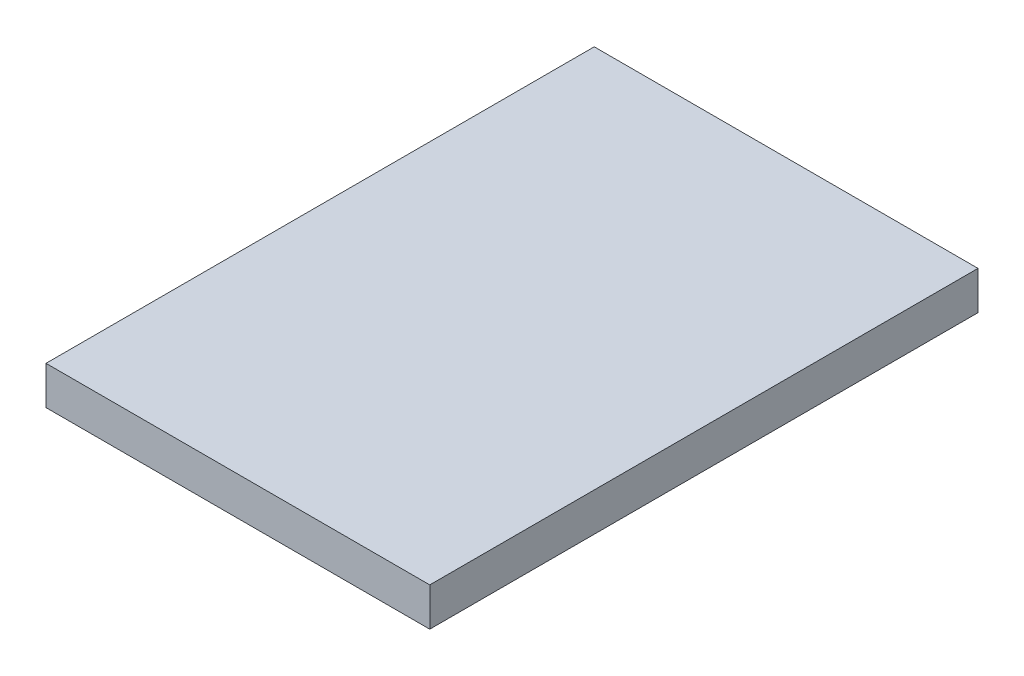
ISO-10303-21;
HEADER;
FILE_DESCRIPTION(('STEP AP214'),'2;1');
FILE_NAME('part.step','',(''),(''),'','','');
FILE_SCHEMA(('AUTOMOTIVE_DESIGN { 1 0 10303 214 1 1 1 1 }'));
ENDSEC;
DATA;
#1=APPLICATION_CONTEXT('core data for automotive mechanical design processes');
#2=APPLICATION_PROTOCOL_DEFINITION('international standard','automotive_design',2000,#1);
#3=PRODUCT_CONTEXT('',#1,'mechanical');
#4=PRODUCT('Part','Part','',(#3));
#5=PRODUCT_RELATED_PRODUCT_CATEGORY('part','',(#4));
#6=PRODUCT_DEFINITION_FORMATION('','',#4);
#7=PRODUCT_DEFINITION_CONTEXT('part definition',#1,'design');
#8=PRODUCT_DEFINITION('design','',#6,#7);
#9=PRODUCT_DEFINITION_SHAPE('','',#8);
#10=(LENGTH_UNIT() NAMED_UNIT(*) SI_UNIT(.MILLI.,.METRE.));
#11=(NAMED_UNIT(*) PLANE_ANGLE_UNIT() SI_UNIT($,.RADIAN.));
#12=(NAMED_UNIT(*) SI_UNIT($,.STERADIAN.) SOLID_ANGLE_UNIT());
#13=UNCERTAINTY_MEASURE_WITH_UNIT(LENGTH_MEASURE(1.E-05),#10,'distance_accuracy_value','');
#14=(GEOMETRIC_REPRESENTATION_CONTEXT(3) GLOBAL_UNCERTAINTY_ASSIGNED_CONTEXT((#13)) GLOBAL_UNIT_ASSIGNED_CONTEXT((#10,
#11,#12)) REPRESENTATION_CONTEXT('',''));
#15=CARTESIAN_POINT('',(0.,0.,0.));
#16=DIRECTION('',(0.,0.,1.));
#17=DIRECTION('',(1.,0.,0.));
#18=AXIS2_PLACEMENT_3D('',#15,#16,#17);
#19=CARTESIAN_POINT('',(35.,7.,50.));
#20=DIRECTION('',(-1.,0.,0.));
#21=DIRECTION('',(0.,0.,1.));
#22=AXIS2_PLACEMENT_3D('',#19,#20,#21);
#23=PLANE('',#22);
#24=DIRECTION('',(0.,0.,-1.));
#25=VECTOR('',#24,1.);
#26=CARTESIAN_POINT('',(35.,0.,50.));
#27=LINE('',#26,#25);
#28=CARTESIAN_POINT('',(35.,0.,50.));
#29=VERTEX_POINT('',#28);
#30=CARTESIAN_POINT('',(35.,0.,-50.));
#31=VERTEX_POINT('',#30);
#32=EDGE_CURVE('E94',#29,#31,#27,.T.);
#33=ORIENTED_EDGE('',*,*,#32,.T.);
#34=DIRECTION('',(0.,-1.,0.));
#35=VECTOR('',#34,1.);
#36=CARTESIAN_POINT('',(35.,7.,-50.));
#37=LINE('',#36,#35);
#38=CARTESIAN_POINT('',(35.,7.,-50.));
#39=VERTEX_POINT('',#38);
#40=EDGE_CURVE('E11',#39,#31,#37,.T.);
#41=ORIENTED_EDGE('',*,*,#40,.F.);
#42=DIRECTION('',(0.,0.,-1.));
#43=VECTOR('',#42,1.);
#44=CARTESIAN_POINT('',(35.,7.,50.));
#45=LINE('',#44,#43);
#46=CARTESIAN_POINT('',(35.,7.,50.));
#47=VERTEX_POINT('',#46);
#48=EDGE_CURVE('E82',#47,#39,#45,.T.);
#49=ORIENTED_EDGE('',*,*,#48,.F.);
#50=DIRECTION('',(0.,-1.,0.));
#51=VECTOR('',#50,1.);
#52=CARTESIAN_POINT('',(35.,7.,50.));
#53=LINE('',#52,#51);
#54=EDGE_CURVE('E90',#47,#29,#53,.T.);
#55=ORIENTED_EDGE('',*,*,#54,.T.);
#56=EDGE_LOOP('',(#33,#41,#49,#55));
#57=FACE_BOUND('',#56,.T.);
#58=ADVANCED_FACE('F31',(#57),#23,.F.);
#59=CARTESIAN_POINT('',(-35.,7.,-50.));
#60=DIRECTION('',(0.,0.,1.));
#61=DIRECTION('',(1.,0.,0.));
#62=AXIS2_PLACEMENT_3D('',#59,#60,#61);
#63=PLANE('',#62);
#64=DIRECTION('',(-1.,0.,0.));
#65=VECTOR('',#64,1.);
#66=CARTESIAN_POINT('',(-35.,0.,-50.));
#67=LINE('',#66,#65);
#68=CARTESIAN_POINT('',(-35.,0.,-50.));
#69=VERTEX_POINT('',#68);
#70=EDGE_CURVE('E86',#31,#69,#67,.T.);
#71=ORIENTED_EDGE('',*,*,#70,.T.);
#72=DIRECTION('',(0.,-1.,0.));
#73=VECTOR('',#72,1.);
#74=CARTESIAN_POINT('',(-35.,7.,-50.));
#75=LINE('',#74,#73);
#76=CARTESIAN_POINT('',(-35.,7.,-50.));
#77=VERTEX_POINT('',#76);
#78=EDGE_CURVE('E39',#77,#69,#75,.T.);
#79=ORIENTED_EDGE('',*,*,#78,.F.);
#80=DIRECTION('',(-1.,0.,0.));
#81=VECTOR('',#80,1.);
#82=CARTESIAN_POINT('',(-35.,7.,-50.));
#83=LINE('',#82,#81);
#84=EDGE_CURVE('E77',#39,#77,#83,.T.);
#85=ORIENTED_EDGE('',*,*,#84,.F.);
#86=ORIENTED_EDGE('',*,*,#40,.T.);
#87=EDGE_LOOP('',(#71,#79,#85,#86));
#88=FACE_BOUND('',#87,.T.);
#89=ADVANCED_FACE('F85',(#88),#63,.F.);
#90=CARTESIAN_POINT('',(-35.,7.,50.));
#91=DIRECTION('',(1.,0.,0.));
#92=DIRECTION('',(0.,0.,-1.));
#93=AXIS2_PLACEMENT_3D('',#90,#91,#92);
#94=PLANE('',#93);
#95=DIRECTION('',(0.,0.,1.));
#96=VECTOR('',#95,1.);
#97=CARTESIAN_POINT('',(-35.,0.,50.));
#98=LINE('',#97,#96);
#99=CARTESIAN_POINT('',(-35.,0.,50.));
#100=VERTEX_POINT('',#99);
#101=EDGE_CURVE('E64',#69,#100,#98,.T.);
#102=ORIENTED_EDGE('',*,*,#101,.T.);
#103=DIRECTION('',(0.,-1.,0.));
#104=VECTOR('',#103,1.);
#105=CARTESIAN_POINT('',(-35.,7.,50.));
#106=LINE('',#105,#104);
#107=CARTESIAN_POINT('',(-35.,7.,50.));
#108=VERTEX_POINT('',#107);
#109=EDGE_CURVE('E87',#108,#100,#106,.T.);
#110=ORIENTED_EDGE('',*,*,#109,.F.);
#111=DIRECTION('',(0.,0.,1.));
#112=VECTOR('',#111,1.);
#113=CARTESIAN_POINT('',(-35.,7.,50.));
#114=LINE('',#113,#112);
#115=EDGE_CURVE('E80',#77,#108,#114,.T.);
#116=ORIENTED_EDGE('',*,*,#115,.F.);
#117=ORIENTED_EDGE('',*,*,#78,.T.);
#118=EDGE_LOOP('',(#102,#110,#116,#117));
#119=FACE_BOUND('',#118,.T.);
#120=ADVANCED_FACE('F88',(#119),#94,.F.);
#121=CARTESIAN_POINT('',(-35.,7.,50.));
#122=DIRECTION('',(0.,0.,-1.));
#123=DIRECTION('',(-1.,0.,0.));
#124=AXIS2_PLACEMENT_3D('',#121,#122,#123);
#125=PLANE('',#124);
#126=DIRECTION('',(1.,0.,0.));
#127=VECTOR('',#126,1.);
#128=CARTESIAN_POINT('',(-35.,0.,50.));
#129=LINE('',#128,#127);
#130=EDGE_CURVE('E70',#100,#29,#129,.T.);
#131=ORIENTED_EDGE('',*,*,#130,.T.);
#132=ORIENTED_EDGE('',*,*,#54,.F.);
#133=DIRECTION('',(1.,0.,0.));
#134=VECTOR('',#133,1.);
#135=CARTESIAN_POINT('',(-35.,7.,50.));
#136=LINE('',#135,#134);
#137=EDGE_CURVE('E47',#108,#47,#136,.T.);
#138=ORIENTED_EDGE('',*,*,#137,.F.);
#139=ORIENTED_EDGE('',*,*,#109,.T.);
#140=EDGE_LOOP('',(#131,#132,#138,#139));
#141=FACE_BOUND('',#140,.T.);
#142=ADVANCED_FACE('F101',(#141),#125,.F.);
#143=CARTESIAN_POINT('',(35.,7.,-50.));
#144=DIRECTION('',(0.,-1.,0.));
#145=DIRECTION('',(0.,0.,-1.));
#146=AXIS2_PLACEMENT_3D('',#143,#144,#145);
#147=PLANE('',#146);
#148=ORIENTED_EDGE('',*,*,#48,.T.);
#149=ORIENTED_EDGE('',*,*,#84,.T.);
#150=ORIENTED_EDGE('',*,*,#115,.T.);
#151=ORIENTED_EDGE('',*,*,#137,.T.);
#152=EDGE_LOOP('',(#148,#149,#150,#151));
#153=FACE_BOUND('',#152,.T.);
#154=ADVANCED_FACE('F78',(#153),#147,.F.);
#155=CARTESIAN_POINT('',(35.,0.,-50.));
#156=DIRECTION('',(0.,-1.,0.));
#157=DIRECTION('',(0.,0.,-1.));
#158=AXIS2_PLACEMENT_3D('',#155,#156,#157);
#159=PLANE('',#158);
#160=ORIENTED_EDGE('',*,*,#32,.F.);
#161=ORIENTED_EDGE('',*,*,#130,.F.);
#162=ORIENTED_EDGE('',*,*,#101,.F.);
#163=ORIENTED_EDGE('',*,*,#70,.F.);
#164=EDGE_LOOP('',(#160,#161,#162,#163));
#165=FACE_BOUND('',#164,.T.);
#166=ADVANCED_FACE('F104',(#165),#159,.T.);
#167=CLOSED_SHELL('',(#58,#89,#120,#142,#154,#166));
#168=MANIFOLD_SOLID_BREP('B2',#167);
#169=ADVANCED_BREP_SHAPE_REPRESENTATION('',(#18,#168),#14);
#170=SHAPE_DEFINITION_REPRESENTATION(#9,#169);
ENDSEC;
END-ISO-10303-21;
